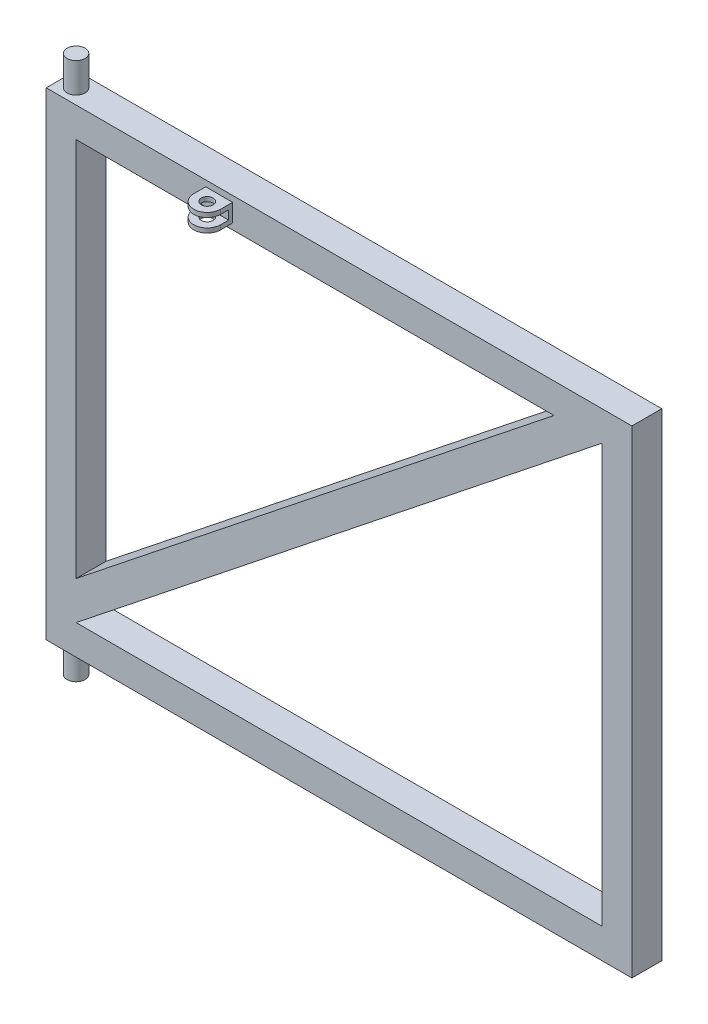
ISO-10303-21;
HEADER;
FILE_DESCRIPTION(('STEP AP214'),'2;1');
FILE_NAME('part.step','',(''),(''),'','','');
FILE_SCHEMA(('AUTOMOTIVE_DESIGN { 1 0 10303 214 1 1 1 1 }'));
ENDSEC;
DATA;
#1=APPLICATION_CONTEXT('core data for automotive mechanical design processes');
#2=APPLICATION_PROTOCOL_DEFINITION('international standard','automotive_design',2000,#1);
#3=PRODUCT_CONTEXT('',#1,'mechanical');
#4=PRODUCT('Part','Part','',(#3));
#5=PRODUCT_RELATED_PRODUCT_CATEGORY('part','',(#4));
#6=PRODUCT_DEFINITION_FORMATION('','',#4);
#7=PRODUCT_DEFINITION_CONTEXT('part definition',#1,'design');
#8=PRODUCT_DEFINITION('design','',#6,#7);
#9=PRODUCT_DEFINITION_SHAPE('','',#8);
#10=(LENGTH_UNIT() NAMED_UNIT(*) SI_UNIT(.MILLI.,.METRE.));
#11=(NAMED_UNIT(*) PLANE_ANGLE_UNIT() SI_UNIT($,.RADIAN.));
#12=(NAMED_UNIT(*) SI_UNIT($,.STERADIAN.) SOLID_ANGLE_UNIT());
#13=UNCERTAINTY_MEASURE_WITH_UNIT(LENGTH_MEASURE(1.E-05),#10,'distance_accuracy_value','');
#14=(GEOMETRIC_REPRESENTATION_CONTEXT(3) GLOBAL_UNCERTAINTY_ASSIGNED_CONTEXT((#13)) GLOBAL_UNIT_ASSIGNED_CONTEXT((#10,
#11,#12)) REPRESENTATION_CONTEXT('',''));
#15=CARTESIAN_POINT('',(0.,0.,0.));
#16=DIRECTION('',(0.,0.,1.));
#17=DIRECTION('',(1.,0.,0.));
#18=AXIS2_PLACEMENT_3D('',#15,#16,#17);
#19=CARTESIAN_POINT('',(311.828309325472,-10.,25.4731353954243));
#20=DIRECTION('',(-1.,0.,0.));
#21=DIRECTION('',(0.,0.,1.));
#22=AXIS2_PLACEMENT_3D('',#19,#20,#21);
#23=PLANE('',#22);
#24=DIRECTION('',(0.,0.,-1.));
#25=VECTOR('',#24,1.);
#26=CARTESIAN_POINT('',(311.828309325472,-32.5,25.4731353954243));
#27=LINE('',#26,#25);
#28=CARTESIAN_POINT('',(311.828309325472,-32.5,70.));
#29=VERTEX_POINT('',#28);
#30=CARTESIAN_POINT('',(311.828309325472,-32.5,56.6012916777462));
#31=VERTEX_POINT('',#30);
#32=EDGE_CURVE('E167',#29,#31,#27,.T.);
#33=ORIENTED_EDGE('',*,*,#32,.F.);
#34=DIRECTION('',(0.,-1.,0.));
#35=VECTOR('',#34,1.);
#36=CARTESIAN_POINT('',(311.828309325472,-10.,70.));
#37=LINE('',#36,#35);
#38=CARTESIAN_POINT('',(311.828309325472,-40.,70.));
#39=VERTEX_POINT('',#38);
#40=EDGE_CURVE('E202',#29,#39,#37,.T.);
#41=ORIENTED_EDGE('',*,*,#40,.T.);
#42=DIRECTION('',(0.,0.,-1.));
#43=VECTOR('',#42,1.);
#44=CARTESIAN_POINT('',(311.828309325472,-40.,25.4731353954243));
#45=LINE('',#44,#43);
#46=CARTESIAN_POINT('',(311.828309325472,-40.,50.));
#47=VERTEX_POINT('',#46);
#48=EDGE_CURVE('E192',#39,#47,#45,.T.);
#49=ORIENTED_EDGE('',*,*,#48,.T.);
#50=DIRECTION('',(0.,-1.,0.));
#51=VECTOR('',#50,1.);
#52=CARTESIAN_POINT('',(311.828309325472,0.,50.));
#53=LINE('',#52,#51);
#54=CARTESIAN_POINT('',(311.828309325472,-10.,50.));
#55=VERTEX_POINT('',#54);
#56=EDGE_CURVE('E40',#55,#47,#53,.T.);
#57=ORIENTED_EDGE('',*,*,#56,.F.);
#58=DIRECTION('',(0.,0.,-1.));
#59=VECTOR('',#58,1.);
#60=CARTESIAN_POINT('',(311.828309325472,-10.,25.4731353954243));
#61=LINE('',#60,#59);
#62=CARTESIAN_POINT('',(311.828309325472,-10.,70.));
#63=VERTEX_POINT('',#62);
#64=EDGE_CURVE('E195',#63,#55,#61,.T.);
#65=ORIENTED_EDGE('',*,*,#64,.F.);
#66=CARTESIAN_POINT('',(311.828309325472,-17.5,70.));
#67=VERTEX_POINT('',#66);
#68=EDGE_CURVE('E176',#63,#67,#37,.T.);
#69=ORIENTED_EDGE('',*,*,#68,.T.);
#70=DIRECTION('',(0.,0.,-1.));
#71=VECTOR('',#70,1.);
#72=CARTESIAN_POINT('',(311.828309325472,-17.5,25.4731353954243));
#73=LINE('',#72,#71);
#74=CARTESIAN_POINT('',(311.828309325472,-17.5,56.6012916777462));
#75=VERTEX_POINT('',#74);
#76=EDGE_CURVE('E47',#67,#75,#73,.T.);
#77=ORIENTED_EDGE('',*,*,#76,.T.);
#78=DIRECTION('',(0.,-1.,0.));
#79=VECTOR('',#78,1.);
#80=CARTESIAN_POINT('',(311.828309325472,-10.,56.6012916777462));
#81=LINE('',#80,#79);
#82=EDGE_CURVE('E159',#75,#31,#81,.T.);
#83=ORIENTED_EDGE('',*,*,#82,.T.);
#84=EDGE_LOOP('',(#33,#41,#49,#57,#65,#69,#77,#83));
#85=FACE_BOUND('',#84,.T.);
#86=ADVANCED_FACE('F32',(#85),#23,.F.);
#87=CARTESIAN_POINT('',(266.828309325472,-10.,25.4731353954243));
#88=DIRECTION('',(1.,0.,0.));
#89=DIRECTION('',(0.,0.,-1.));
#90=AXIS2_PLACEMENT_3D('',#87,#88,#89);
#91=PLANE('',#90);
#92=DIRECTION('',(0.,0.,1.));
#93=VECTOR('',#92,1.);
#94=CARTESIAN_POINT('',(266.828309325472,-32.5,25.4731353954243));
#95=LINE('',#94,#93);
#96=CARTESIAN_POINT('',(266.828309325472,-32.5,56.6012916777462));
#97=VERTEX_POINT('',#96);
#98=CARTESIAN_POINT('',(266.828309325472,-32.5,70.));
#99=VERTEX_POINT('',#98);
#100=EDGE_CURVE('E186',#97,#99,#95,.T.);
#101=ORIENTED_EDGE('',*,*,#100,.F.);
#102=DIRECTION('',(0.,1.,0.));
#103=VECTOR('',#102,1.);
#104=CARTESIAN_POINT('',(266.828309325472,-10.,56.6012916777462));
#105=LINE('',#104,#103);
#106=CARTESIAN_POINT('',(266.828309325472,-17.5,56.6012916777462));
#107=VERTEX_POINT('',#106);
#108=EDGE_CURVE('E11',#97,#107,#105,.T.);
#109=ORIENTED_EDGE('',*,*,#108,.T.);
#110=DIRECTION('',(0.,0.,1.));
#111=VECTOR('',#110,1.);
#112=CARTESIAN_POINT('',(266.828309325472,-17.5,25.4731353954243));
#113=LINE('',#112,#111);
#114=CARTESIAN_POINT('',(266.828309325472,-17.5,70.));
#115=VERTEX_POINT('',#114);
#116=EDGE_CURVE('E171',#107,#115,#113,.T.);
#117=ORIENTED_EDGE('',*,*,#116,.T.);
#118=DIRECTION('',(0.,-1.,0.));
#119=VECTOR('',#118,1.);
#120=CARTESIAN_POINT('',(266.828309325472,-10.,70.));
#121=LINE('',#120,#119);
#122=CARTESIAN_POINT('',(266.828309325472,-10.,70.));
#123=VERTEX_POINT('',#122);
#124=EDGE_CURVE('E212',#123,#115,#121,.T.);
#125=ORIENTED_EDGE('',*,*,#124,.F.);
#126=DIRECTION('',(0.,0.,1.));
#127=VECTOR('',#126,1.);
#128=CARTESIAN_POINT('',(266.828309325472,-10.,25.4731353954243));
#129=LINE('',#128,#127);
#130=CARTESIAN_POINT('',(266.828309325472,-10.,50.));
#131=VERTEX_POINT('',#130);
#132=EDGE_CURVE('E55',#131,#123,#129,.T.);
#133=ORIENTED_EDGE('',*,*,#132,.F.);
#134=DIRECTION('',(0.,1.,0.));
#135=VECTOR('',#134,1.);
#136=CARTESIAN_POINT('',(266.828309325472,0.,50.));
#137=LINE('',#136,#135);
#138=CARTESIAN_POINT('',(266.828309325472,-40.,50.));
#139=VERTEX_POINT('',#138);
#140=EDGE_CURVE('E305',#139,#131,#137,.T.);
#141=ORIENTED_EDGE('',*,*,#140,.F.);
#142=DIRECTION('',(0.,0.,1.));
#143=VECTOR('',#142,1.);
#144=CARTESIAN_POINT('',(266.828309325472,-40.,25.4731353954243));
#145=LINE('',#144,#143);
#146=CARTESIAN_POINT('',(266.828309325472,-40.,70.));
#147=VERTEX_POINT('',#146);
#148=EDGE_CURVE('E205',#139,#147,#145,.T.);
#149=ORIENTED_EDGE('',*,*,#148,.T.);
#150=EDGE_CURVE('E211',#99,#147,#121,.T.);
#151=ORIENTED_EDGE('',*,*,#150,.F.);
#152=EDGE_LOOP('',(#101,#109,#117,#125,#133,#141,#149,#151));
#153=FACE_BOUND('',#152,.T.);
#154=ADVANCED_FACE('F325',(#153),#91,.F.);
#155=CARTESIAN_POINT('',(289.328309325472,-10.,70.));
#156=DIRECTION('',(0.,-1.,0.));
#157=DIRECTION('',(0.,0.,-1.));
#158=AXIS2_PLACEMENT_3D('',#155,#156,#157);
#159=CYLINDRICAL_SURFACE('',#158,22.5);
#160=CARTESIAN_POINT('',(289.328309325472,-32.5,70.));
#161=DIRECTION('',(0.,1.,0.));
#162=DIRECTION('',(0.,0.,1.));
#163=AXIS2_PLACEMENT_3D('',#160,#161,#162);
#164=CIRCLE('',#163,22.5);
#165=EDGE_CURVE('E180',#99,#29,#164,.T.);
#166=ORIENTED_EDGE('',*,*,#165,.F.);
#167=ORIENTED_EDGE('',*,*,#150,.T.);
#168=CARTESIAN_POINT('',(289.328309325472,-40.,70.));
#169=DIRECTION('',(0.,1.,0.));
#170=DIRECTION('',(0.,0.,1.));
#171=AXIS2_PLACEMENT_3D('',#168,#169,#170);
#172=CIRCLE('',#171,22.5);
#173=EDGE_CURVE('E198',#147,#39,#172,.T.);
#174=ORIENTED_EDGE('',*,*,#173,.T.);
#175=ORIENTED_EDGE('',*,*,#40,.F.);
#176=EDGE_LOOP('',(#166,#167,#174,#175));
#177=FACE_BOUND('',#176,.T.);
#178=ADVANCED_FACE('F329',(#177),#159,.T.);
#179=CARTESIAN_POINT('',(289.328309325472,-10.,70.));
#180=DIRECTION('',(0.,-1.,0.));
#181=DIRECTION('',(0.,0.,-1.));
#182=AXIS2_PLACEMENT_3D('',#179,#180,#181);
#183=CYLINDRICAL_SURFACE('',#182,9.99999999999998);
#184=CARTESIAN_POINT('',(289.328309325472,-40.,70.));
#185=DIRECTION('',(0.,1.,0.));
#186=DIRECTION('',(0.,0.,1.));
#187=AXIS2_PLACEMENT_3D('',#184,#185,#186);
#188=CIRCLE('',#187,9.99999999999998);
#189=CARTESIAN_POINT('',(289.328309325472,-40.,80.));
#190=VERTEX_POINT('',#189);
#191=EDGE_CURVE('E166',#190,#190,#188,.T.);
#192=ORIENTED_EDGE('',*,*,#191,.F.);
#193=EDGE_LOOP('',(#192));
#194=FACE_BOUND('',#193,.T.);
#195=CARTESIAN_POINT('',(289.328309325472,-32.5,70.));
#196=DIRECTION('',(0.,1.,0.));
#197=DIRECTION('',(0.,0.,1.));
#198=AXIS2_PLACEMENT_3D('',#195,#196,#197);
#199=CIRCLE('',#198,9.99999999999998);
#200=CARTESIAN_POINT('',(289.328309325472,-32.5,80.));
#201=VERTEX_POINT('',#200);
#202=EDGE_CURVE('E177',#201,#201,#199,.T.);
#203=ORIENTED_EDGE('',*,*,#202,.T.);
#204=EDGE_LOOP('',(#203));
#205=FACE_BOUND('',#204,.T.);
#206=ADVANCED_FACE('F352',(#194,#205),#183,.F.);
#207=CARTESIAN_POINT('',(0.,0.,50.));
#208=DIRECTION('',(0.,0.,1.));
#209=DIRECTION('',(1.,0.,0.));
#210=AXIS2_PLACEMENT_3D('',#207,#208,#209);
#211=PLANE('',#210);
#212=DIRECTION('',(1.,0.,0.));
#213=VECTOR('',#212,1.);
#214=CARTESIAN_POINT('',(50.,-750.,50.));
#215=LINE('',#214,#213);
#216=CARTESIAN_POINT('',(50.,-750.,50.));
#217=VERTEX_POINT('',#216);
#218=CARTESIAN_POINT('',(930.,-750.,50.));
#219=VERTEX_POINT('',#218);
#220=EDGE_CURVE('E224',#217,#219,#215,.T.);
#221=ORIENTED_EDGE('',*,*,#220,.F.);
#222=DIRECTION('',(-0.782601054175649,-0.622523565821539,0.));
#223=VECTOR('',#222,1.);
#224=CARTESIAN_POINT('',(930.,-50.,50.));
#225=LINE('',#224,#223);
#226=CARTESIAN_POINT('',(930.,-50.,50.));
#227=VERTEX_POINT('',#226);
#228=EDGE_CURVE('E222',#227,#217,#225,.T.);
#229=ORIENTED_EDGE('',*,*,#228,.F.);
#230=DIRECTION('',(0.,1.,0.));
#231=VECTOR('',#230,1.);
#232=CARTESIAN_POINT('',(930.,-50.,50.));
#233=LINE('',#232,#231);
#234=EDGE_CURVE('E228',#219,#227,#233,.T.);
#235=ORIENTED_EDGE('',*,*,#234,.F.);
#236=EDGE_LOOP('',(#221,#229,#235));
#237=FACE_BOUND('',#236,.T.);
#238=DIRECTION('',(0.,-1.,0.));
#239=VECTOR('',#238,1.);
#240=CARTESIAN_POINT('',(0.,0.,50.));
#241=LINE('',#240,#239);
#242=CARTESIAN_POINT('',(0.,0.,50.));
#243=VERTEX_POINT('',#242);
#244=CARTESIAN_POINT('',(0.,-800.,50.));
#245=VERTEX_POINT('',#244);
#246=EDGE_CURVE('E270',#243,#245,#241,.T.);
#247=ORIENTED_EDGE('',*,*,#246,.T.);
#248=DIRECTION('',(1.,0.,0.));
#249=VECTOR('',#248,1.);
#250=CARTESIAN_POINT('',(0.,-800.,50.));
#251=LINE('',#250,#249);
#252=CARTESIAN_POINT('',(980.,-800.,50.));
#253=VERTEX_POINT('',#252);
#254=EDGE_CURVE('E273',#245,#253,#251,.T.);
#255=ORIENTED_EDGE('',*,*,#254,.T.);
#256=DIRECTION('',(0.,1.,0.));
#257=VECTOR('',#256,1.);
#258=CARTESIAN_POINT('',(980.,0.,50.));
#259=LINE('',#258,#257);
#260=CARTESIAN_POINT('',(980.,0.,50.));
#261=VERTEX_POINT('',#260);
#262=EDGE_CURVE('E276',#253,#261,#259,.T.);
#263=ORIENTED_EDGE('',*,*,#262,.T.);
#264=DIRECTION('',(-1.,0.,0.));
#265=VECTOR('',#264,1.);
#266=CARTESIAN_POINT('',(0.,0.,50.));
#267=LINE('',#266,#265);
#268=EDGE_CURVE('E278',#261,#243,#267,.T.);
#269=ORIENTED_EDGE('',*,*,#268,.T.);
#270=EDGE_LOOP('',(#247,#255,#263,#269));
#271=FACE_BOUND('',#270,.T.);
#272=DIRECTION('',(0.782601054175649,0.622523565821539,0.));
#273=VECTOR('',#272,1.);
#274=CARTESIAN_POINT('',(849.681755446454,-50.,50.));
#275=LINE('',#274,#273);
#276=CARTESIAN_POINT('',(50.0000000000002,-686.110487286952,50.));
#277=VERTEX_POINT('',#276);
#278=CARTESIAN_POINT('',(849.681755446454,-50.,50.));
#279=VERTEX_POINT('',#278);
#280=EDGE_CURVE('E248',#277,#279,#275,.T.);
#281=ORIENTED_EDGE('',*,*,#280,.F.);
#282=DIRECTION('',(0.,-1.,0.));
#283=VECTOR('',#282,1.);
#284=CARTESIAN_POINT('',(50.,-50.,50.));
#285=LINE('',#284,#283);
#286=CARTESIAN_POINT('',(50.,-50.,50.));
#287=VERTEX_POINT('',#286);
#288=EDGE_CURVE('E246',#287,#277,#285,.T.);
#289=ORIENTED_EDGE('',*,*,#288,.F.);
#290=DIRECTION('',(-1.,0.,0.));
#291=VECTOR('',#290,1.);
#292=CARTESIAN_POINT('',(50.,-50.,50.));
#293=LINE('',#292,#291);
#294=EDGE_CURVE('E252',#279,#287,#293,.T.);
#295=ORIENTED_EDGE('',*,*,#294,.F.);
#296=EDGE_LOOP('',(#281,#289,#295));
#297=FACE_BOUND('',#296,.T.);
#298=DIRECTION('',(-1.,0.,0.));
#299=VECTOR('',#298,1.);
#300=CARTESIAN_POINT('',(0.,-10.,50.));
#301=LINE('',#300,#299);
#302=EDGE_CURVE('E311',#55,#131,#301,.T.);
#303=ORIENTED_EDGE('',*,*,#302,.F.);
#304=ORIENTED_EDGE('',*,*,#56,.T.);
#305=DIRECTION('',(-1.,0.,0.));
#306=VECTOR('',#305,1.);
#307=CARTESIAN_POINT('',(0.,-40.,50.));
#308=LINE('',#307,#306);
#309=EDGE_CURVE('E308',#47,#139,#308,.T.);
#310=ORIENTED_EDGE('',*,*,#309,.T.);
#311=ORIENTED_EDGE('',*,*,#140,.T.);
#312=EDGE_LOOP('',(#303,#304,#310,#311));
#313=FACE_BOUND('',#312,.T.);
#314=ADVANCED_FACE('F335',(#237,#271,#297,#313),#211,.T.);
#315=CARTESIAN_POINT('',(0.,-800.,50.));
#316=DIRECTION('',(0.,1.,0.));
#317=DIRECTION('',(0.,0.,1.));
#318=AXIS2_PLACEMENT_3D('',#315,#316,#317);
#319=PLANE('',#318);
#320=DIRECTION('',(1.,0.,0.));
#321=VECTOR('',#320,1.);
#322=CARTESIAN_POINT('',(0.,-800.,0.));
#323=LINE('',#322,#321);
#324=CARTESIAN_POINT('',(0.,-800.,0.));
#325=VERTEX_POINT('',#324);
#326=CARTESIAN_POINT('',(980.,-800.,0.));
#327=VERTEX_POINT('',#326);
#328=EDGE_CURVE('E283',#325,#327,#323,.T.);
#329=ORIENTED_EDGE('',*,*,#328,.T.);
#330=DIRECTION('',(0.,0.,-1.));
#331=VECTOR('',#330,1.);
#332=CARTESIAN_POINT('',(980.,-800.,50.));
#333=LINE('',#332,#331);
#334=EDGE_CURVE('E293',#253,#327,#333,.T.);
#335=ORIENTED_EDGE('',*,*,#334,.F.);
#336=ORIENTED_EDGE('',*,*,#254,.F.);
#337=DIRECTION('',(0.,0.,-1.));
#338=VECTOR('',#337,1.);
#339=CARTESIAN_POINT('',(0.,-800.,50.));
#340=LINE('',#339,#338);
#341=EDGE_CURVE('E296',#245,#325,#340,.T.);
#342=ORIENTED_EDGE('',*,*,#341,.T.);
#343=EDGE_LOOP('',(#329,#335,#336,#342));
#344=FACE_BOUND('',#343,.T.);
#345=CARTESIAN_POINT('',(25.0000000000001,-800.,25.));
#346=DIRECTION('',(0.,1.,0.));
#347=DIRECTION('',(0.,0.,1.));
#348=AXIS2_PLACEMENT_3D('',#345,#346,#347);
#349=CIRCLE('',#348,15.1806494494517);
#350=CARTESIAN_POINT('',(25.0000000000001,-800.,40.1806494494517));
#351=VERTEX_POINT('',#350);
#352=EDGE_CURVE('E302',#351,#351,#349,.F.);
#353=ORIENTED_EDGE('',*,*,#352,.F.);
#354=EDGE_LOOP('',(#353));
#355=FACE_BOUND('',#354,.T.);
#356=ADVANCED_FACE('F405',(#344,#355),#319,.F.);
#357=CARTESIAN_POINT('',(0.,0.,50.));
#358=DIRECTION('',(0.,-1.,0.));
#359=DIRECTION('',(0.,0.,-1.));
#360=AXIS2_PLACEMENT_3D('',#357,#358,#359);
#361=PLANE('',#360);
#362=DIRECTION('',(-1.,0.,0.));
#363=VECTOR('',#362,1.);
#364=CARTESIAN_POINT('',(0.,0.,0.));
#365=LINE('',#364,#363);
#366=CARTESIAN_POINT('',(980.,0.,0.));
#367=VERTEX_POINT('',#366);
#368=CARTESIAN_POINT('',(0.,0.,0.));
#369=VERTEX_POINT('',#368);
#370=EDGE_CURVE('E274',#367,#369,#365,.T.);
#371=ORIENTED_EDGE('',*,*,#370,.T.);
#372=DIRECTION('',(0.,0.,-1.));
#373=VECTOR('',#372,1.);
#374=CARTESIAN_POINT('',(0.,0.,50.));
#375=LINE('',#374,#373);
#376=EDGE_CURVE('E280',#243,#369,#375,.T.);
#377=ORIENTED_EDGE('',*,*,#376,.F.);
#378=ORIENTED_EDGE('',*,*,#268,.F.);
#379=DIRECTION('',(0.,0.,-1.));
#380=VECTOR('',#379,1.);
#381=CARTESIAN_POINT('',(980.,0.,50.));
#382=LINE('',#381,#380);
#383=EDGE_CURVE('E290',#261,#367,#382,.T.);
#384=ORIENTED_EDGE('',*,*,#383,.T.);
#385=EDGE_LOOP('',(#371,#377,#378,#384));
#386=FACE_BOUND('',#385,.T.);
#387=CARTESIAN_POINT('',(25.,0.,25.));
#388=DIRECTION('',(0.,-1.,0.));
#389=DIRECTION('',(0.,0.,-1.));
#390=AXIS2_PLACEMENT_3D('',#387,#388,#389);
#391=CIRCLE('',#390,15.);
#392=CARTESIAN_POINT('',(25.,0.,10.));
#393=VERTEX_POINT('',#392);
#394=EDGE_CURVE('E299',#393,#393,#391,.F.);
#395=ORIENTED_EDGE('',*,*,#394,.F.);
#396=EDGE_LOOP('',(#395));
#397=FACE_BOUND('',#396,.T.);
#398=ADVANCED_FACE('F410',(#386,#397),#361,.F.);
#399=CARTESIAN_POINT('',(0.,0.,0.));
#400=DIRECTION('',(0.,0.,1.));
#401=DIRECTION('',(1.,0.,0.));
#402=AXIS2_PLACEMENT_3D('',#399,#400,#401);
#403=PLANE('',#402);
#404=DIRECTION('',(0.,-1.,0.));
#405=VECTOR('',#404,1.);
#406=CARTESIAN_POINT('',(50.,-50.,0.));
#407=LINE('',#406,#405);
#408=CARTESIAN_POINT('',(50.,-50.,0.));
#409=VERTEX_POINT('',#408);
#410=CARTESIAN_POINT('',(50.0000000000002,-686.110487286952,0.));
#411=VERTEX_POINT('',#410);
#412=EDGE_CURVE('E245',#409,#411,#407,.T.);
#413=ORIENTED_EDGE('',*,*,#412,.T.);
#414=DIRECTION('',(0.782601054175649,0.622523565821539,0.));
#415=VECTOR('',#414,1.);
#416=CARTESIAN_POINT('',(849.681755446454,-50.,0.));
#417=LINE('',#416,#415);
#418=CARTESIAN_POINT('',(849.681755446454,-50.,0.));
#419=VERTEX_POINT('',#418);
#420=EDGE_CURVE('E257',#411,#419,#417,.T.);
#421=ORIENTED_EDGE('',*,*,#420,.T.);
#422=DIRECTION('',(-1.,0.,0.));
#423=VECTOR('',#422,1.);
#424=CARTESIAN_POINT('',(50.,-50.,0.));
#425=LINE('',#424,#423);
#426=EDGE_CURVE('E249',#419,#409,#425,.T.);
#427=ORIENTED_EDGE('',*,*,#426,.T.);
#428=EDGE_LOOP('',(#413,#421,#427));
#429=FACE_BOUND('',#428,.T.);
#430=DIRECTION('',(0.,-1.,0.));
#431=VECTOR('',#430,1.);
#432=CARTESIAN_POINT('',(0.,0.,0.));
#433=LINE('',#432,#431);
#434=EDGE_CURVE('E269',#369,#325,#433,.T.);
#435=ORIENTED_EDGE('',*,*,#434,.F.);
#436=ORIENTED_EDGE('',*,*,#370,.F.);
#437=DIRECTION('',(0.,1.,0.));
#438=VECTOR('',#437,1.);
#439=CARTESIAN_POINT('',(980.,0.,0.));
#440=LINE('',#439,#438);
#441=EDGE_CURVE('E285',#327,#367,#440,.T.);
#442=ORIENTED_EDGE('',*,*,#441,.F.);
#443=ORIENTED_EDGE('',*,*,#328,.F.);
#444=EDGE_LOOP('',(#435,#436,#442,#443));
#445=FACE_BOUND('',#444,.T.);
#446=DIRECTION('',(-0.782601054175649,-0.622523565821539,0.));
#447=VECTOR('',#446,1.);
#448=CARTESIAN_POINT('',(930.,-50.,0.));
#449=LINE('',#448,#447);
#450=CARTESIAN_POINT('',(930.,-50.,0.));
#451=VERTEX_POINT('',#450);
#452=CARTESIAN_POINT('',(50.,-750.,0.));
#453=VERTEX_POINT('',#452);
#454=EDGE_CURVE('E221',#451,#453,#449,.T.);
#455=ORIENTED_EDGE('',*,*,#454,.T.);
#456=DIRECTION('',(1.,0.,0.));
#457=VECTOR('',#456,1.);
#458=CARTESIAN_POINT('',(50.,-750.,0.));
#459=LINE('',#458,#457);
#460=CARTESIAN_POINT('',(930.,-750.,0.));
#461=VERTEX_POINT('',#460);
#462=EDGE_CURVE('E233',#453,#461,#459,.T.);
#463=ORIENTED_EDGE('',*,*,#462,.T.);
#464=DIRECTION('',(0.,1.,0.));
#465=VECTOR('',#464,1.);
#466=CARTESIAN_POINT('',(930.,-50.,0.));
#467=LINE('',#466,#465);
#468=EDGE_CURVE('E225',#461,#451,#467,.T.);
#469=ORIENTED_EDGE('',*,*,#468,.T.);
#470=EDGE_LOOP('',(#455,#463,#469));
#471=FACE_BOUND('',#470,.T.);
#472=ADVANCED_FACE('F407',(#429,#445,#471),#403,.F.);
#473=CARTESIAN_POINT('',(0.,0.,50.));
#474=DIRECTION('',(1.,0.,0.));
#475=DIRECTION('',(0.,1.,0.));
#476=AXIS2_PLACEMENT_3D('',#473,#474,#475);
#477=PLANE('',#476);
#478=ORIENTED_EDGE('',*,*,#434,.T.);
#479=ORIENTED_EDGE('',*,*,#341,.F.);
#480=ORIENTED_EDGE('',*,*,#246,.F.);
#481=ORIENTED_EDGE('',*,*,#376,.T.);
#482=EDGE_LOOP('',(#478,#479,#480,#481));
#483=FACE_BOUND('',#482,.T.);
#484=ADVANCED_FACE('F34',(#483),#477,.F.);
#485=CARTESIAN_POINT('',(980.,0.,50.));
#486=DIRECTION('',(-1.,0.,0.));
#487=DIRECTION('',(0.,-1.,0.));
#488=AXIS2_PLACEMENT_3D('',#485,#486,#487);
#489=PLANE('',#488);
#490=ORIENTED_EDGE('',*,*,#441,.T.);
#491=ORIENTED_EDGE('',*,*,#383,.F.);
#492=ORIENTED_EDGE('',*,*,#262,.F.);
#493=ORIENTED_EDGE('',*,*,#334,.T.);
#494=EDGE_LOOP('',(#490,#491,#492,#493));
#495=FACE_BOUND('',#494,.T.);
#496=ADVANCED_FACE('F401',(#495),#489,.F.);
#497=CARTESIAN_POINT('',(50.,-50.,50.));
#498=DIRECTION('',(1.,0.,0.));
#499=DIRECTION('',(0.,1.,0.));
#500=AXIS2_PLACEMENT_3D('',#497,#498,#499);
#501=PLANE('',#500);
#502=ORIENTED_EDGE('',*,*,#412,.F.);
#503=DIRECTION('',(0.,0.,-1.));
#504=VECTOR('',#503,1.);
#505=CARTESIAN_POINT('',(50.,-50.,50.));
#506=LINE('',#505,#504);
#507=EDGE_CURVE('E254',#287,#409,#506,.T.);
#508=ORIENTED_EDGE('',*,*,#507,.F.);
#509=ORIENTED_EDGE('',*,*,#288,.T.);
#510=DIRECTION('',(0.,0.,-1.));
#511=VECTOR('',#510,1.);
#512=CARTESIAN_POINT('',(50.0000000000002,-686.110487286952,50.));
#513=LINE('',#512,#511);
#514=EDGE_CURVE('E266',#277,#411,#513,.T.);
#515=ORIENTED_EDGE('',*,*,#514,.T.);
#516=EDGE_LOOP('',(#502,#508,#509,#515));
#517=FACE_BOUND('',#516,.T.);
#518=ADVANCED_FACE('F397',(#517),#501,.T.);
#519=CARTESIAN_POINT('',(849.681755446454,-50.,50.));
#520=DIRECTION('',(-0.622523565821539,0.782601054175648,0.));
#521=DIRECTION('',(-0.782601054175648,-0.622523565821539,0.));
#522=AXIS2_PLACEMENT_3D('',#519,#520,#521);
#523=PLANE('',#522);
#524=ORIENTED_EDGE('',*,*,#420,.F.);
#525=ORIENTED_EDGE('',*,*,#514,.F.);
#526=ORIENTED_EDGE('',*,*,#280,.T.);
#527=DIRECTION('',(0.,0.,-1.));
#528=VECTOR('',#527,1.);
#529=CARTESIAN_POINT('',(849.681755446454,-50.,50.));
#530=LINE('',#529,#528);
#531=EDGE_CURVE('E264',#279,#419,#530,.T.);
#532=ORIENTED_EDGE('',*,*,#531,.T.);
#533=EDGE_LOOP('',(#524,#525,#526,#532));
#534=FACE_BOUND('',#533,.T.);
#535=ADVANCED_FACE('F393',(#534),#523,.T.);
#536=CARTESIAN_POINT('',(50.,-50.,50.));
#537=DIRECTION('',(0.,-1.,0.));
#538=DIRECTION('',(1.,0.,0.));
#539=AXIS2_PLACEMENT_3D('',#536,#537,#538);
#540=PLANE('',#539);
#541=ORIENTED_EDGE('',*,*,#426,.F.);
#542=ORIENTED_EDGE('',*,*,#531,.F.);
#543=ORIENTED_EDGE('',*,*,#294,.T.);
#544=ORIENTED_EDGE('',*,*,#507,.T.);
#545=EDGE_LOOP('',(#541,#542,#543,#544));
#546=FACE_BOUND('',#545,.T.);
#547=ADVANCED_FACE('F389',(#546),#540,.T.);
#548=CARTESIAN_POINT('',(930.,-50.,50.));
#549=DIRECTION('',(0.622523565821539,-0.782601054175649,0.));
#550=DIRECTION('',(0.782601054175649,0.622523565821539,0.));
#551=AXIS2_PLACEMENT_3D('',#548,#549,#550);
#552=PLANE('',#551);
#553=ORIENTED_EDGE('',*,*,#454,.F.);
#554=DIRECTION('',(0.,0.,-1.));
#555=VECTOR('',#554,1.);
#556=CARTESIAN_POINT('',(930.,-50.,50.));
#557=LINE('',#556,#555);
#558=EDGE_CURVE('E230',#227,#451,#557,.T.);
#559=ORIENTED_EDGE('',*,*,#558,.F.);
#560=ORIENTED_EDGE('',*,*,#228,.T.);
#561=DIRECTION('',(0.,0.,-1.));
#562=VECTOR('',#561,1.);
#563=CARTESIAN_POINT('',(50.,-750.,50.));
#564=LINE('',#563,#562);
#565=EDGE_CURVE('E242',#217,#453,#564,.T.);
#566=ORIENTED_EDGE('',*,*,#565,.T.);
#567=EDGE_LOOP('',(#553,#559,#560,#566));
#568=FACE_BOUND('',#567,.T.);
#569=ADVANCED_FACE('F385',(#568),#552,.T.);
#570=CARTESIAN_POINT('',(50.,-750.,50.));
#571=DIRECTION('',(0.,1.,0.));
#572=DIRECTION('',(0.,0.,1.));
#573=AXIS2_PLACEMENT_3D('',#570,#571,#572);
#574=PLANE('',#573);
#575=ORIENTED_EDGE('',*,*,#462,.F.);
#576=ORIENTED_EDGE('',*,*,#565,.F.);
#577=ORIENTED_EDGE('',*,*,#220,.T.);
#578=DIRECTION('',(0.,0.,-1.));
#579=VECTOR('',#578,1.);
#580=CARTESIAN_POINT('',(930.,-750.,50.));
#581=LINE('',#580,#579);
#582=EDGE_CURVE('E240',#219,#461,#581,.T.);
#583=ORIENTED_EDGE('',*,*,#582,.T.);
#584=EDGE_LOOP('',(#575,#576,#577,#583));
#585=FACE_BOUND('',#584,.T.);
#586=ADVANCED_FACE('F381',(#585),#574,.T.);
#587=CARTESIAN_POINT('',(930.,-50.,50.));
#588=DIRECTION('',(-1.,0.,0.));
#589=DIRECTION('',(0.,-1.,0.));
#590=AXIS2_PLACEMENT_3D('',#587,#588,#589);
#591=PLANE('',#590);
#592=ORIENTED_EDGE('',*,*,#468,.F.);
#593=ORIENTED_EDGE('',*,*,#582,.F.);
#594=ORIENTED_EDGE('',*,*,#234,.T.);
#595=ORIENTED_EDGE('',*,*,#558,.T.);
#596=EDGE_LOOP('',(#592,#593,#594,#595));
#597=FACE_BOUND('',#596,.T.);
#598=ADVANCED_FACE('F377',(#597),#591,.T.);
#599=CARTESIAN_POINT('',(25.,50.,25.));
#600=DIRECTION('',(0.,-1.,0.));
#601=DIRECTION('',(0.,0.,-1.));
#602=AXIS2_PLACEMENT_3D('',#599,#600,#601);
#603=CYLINDRICAL_SURFACE('',#602,15.);
#604=CARTESIAN_POINT('',(25.,50.,25.));
#605=DIRECTION('',(0.,1.,0.));
#606=DIRECTION('',(0.,0.,1.));
#607=AXIS2_PLACEMENT_3D('',#604,#605,#606);
#608=CIRCLE('',#607,15.);
#609=CARTESIAN_POINT('',(25.,50.,40.));
#610=VERTEX_POINT('',#609);
#611=EDGE_CURVE('E218',#610,#610,#608,.T.);
#612=ORIENTED_EDGE('',*,*,#611,.F.);
#613=EDGE_LOOP('',(#612));
#614=FACE_BOUND('',#613,.T.);
#615=ORIENTED_EDGE('',*,*,#394,.T.);
#616=EDGE_LOOP('',(#615));
#617=FACE_BOUND('',#616,.T.);
#618=ADVANCED_FACE('F373',(#614,#617),#603,.T.);
#619=CARTESIAN_POINT('',(25.,50.,25.));
#620=DIRECTION('',(0.,1.,0.));
#621=DIRECTION('',(0.,0.,1.));
#622=AXIS2_PLACEMENT_3D('',#619,#620,#621);
#623=PLANE('',#622);
#624=ORIENTED_EDGE('',*,*,#611,.T.);
#625=EDGE_LOOP('',(#624));
#626=FACE_BOUND('',#625,.T.);
#627=ADVANCED_FACE('F369',(#626),#623,.T.);
#628=CARTESIAN_POINT('',(25.0000000000001,-850.,25.));
#629=DIRECTION('',(0.,1.,0.));
#630=DIRECTION('',(0.,0.,1.));
#631=AXIS2_PLACEMENT_3D('',#628,#629,#630);
#632=CYLINDRICAL_SURFACE('',#631,15.1806494494517);
#633=CARTESIAN_POINT('',(25.0000000000001,-850.,25.));
#634=DIRECTION('',(0.,-1.,0.));
#635=DIRECTION('',(0.,0.,-1.));
#636=AXIS2_PLACEMENT_3D('',#633,#634,#635);
#637=CIRCLE('',#636,15.1806494494517);
#638=CARTESIAN_POINT('',(25.0000000000001,-850.,9.81935055054828));
#639=VERTEX_POINT('',#638);
#640=EDGE_CURVE('E215',#639,#639,#637,.T.);
#641=ORIENTED_EDGE('',*,*,#640,.F.);
#642=EDGE_LOOP('',(#641));
#643=FACE_BOUND('',#642,.T.);
#644=ORIENTED_EDGE('',*,*,#352,.T.);
#645=EDGE_LOOP('',(#644));
#646=FACE_BOUND('',#645,.T.);
#647=ADVANCED_FACE('F365',(#643,#646),#632,.T.);
#648=CARTESIAN_POINT('',(25.0000000000001,-850.,25.));
#649=DIRECTION('',(0.,-1.,0.));
#650=DIRECTION('',(0.,0.,-1.));
#651=AXIS2_PLACEMENT_3D('',#648,#649,#650);
#652=PLANE('',#651);
#653=ORIENTED_EDGE('',*,*,#640,.T.);
#654=EDGE_LOOP('',(#653));
#655=FACE_BOUND('',#654,.T.);
#656=ADVANCED_FACE('F362',(#655),#652,.T.);
#657=CARTESIAN_POINT('',(289.328309325472,-10.,70.));
#658=DIRECTION('',(0.,1.,0.));
#659=DIRECTION('',(0.,0.,1.));
#660=AXIS2_PLACEMENT_3D('',#657,#658,#659);
#661=PLANE('',#660);
#662=ORIENTED_EDGE('',*,*,#64,.T.);
#663=ORIENTED_EDGE('',*,*,#302,.T.);
#664=ORIENTED_EDGE('',*,*,#132,.T.);
#665=CARTESIAN_POINT('',(289.328309325472,-10.,70.));
#666=DIRECTION('',(0.,1.,0.));
#667=DIRECTION('',(0.,0.,1.));
#668=AXIS2_PLACEMENT_3D('',#665,#666,#667);
#669=CIRCLE('',#668,22.5);
#670=EDGE_CURVE('E200',#123,#63,#669,.T.);
#671=ORIENTED_EDGE('',*,*,#670,.T.);
#672=EDGE_LOOP('',(#662,#663,#664,#671));
#673=FACE_BOUND('',#672,.T.);
#674=CARTESIAN_POINT('',(289.328309325472,-10.,70.));
#675=DIRECTION('',(0.,1.,0.));
#676=DIRECTION('',(0.,0.,1.));
#677=AXIS2_PLACEMENT_3D('',#674,#675,#676);
#678=CIRCLE('',#677,9.99999999999998);
#679=CARTESIAN_POINT('',(289.328309325472,-10.,80.));
#680=VERTEX_POINT('',#679);
#681=EDGE_CURVE('E189',#680,#680,#678,.T.);
#682=ORIENTED_EDGE('',*,*,#681,.F.);
#683=EDGE_LOOP('',(#682));
#684=FACE_BOUND('',#683,.T.);
#685=ADVANCED_FACE('F337',(#673,#684),#661,.T.);
#686=CARTESIAN_POINT('',(289.328309325472,-40.,70.));
#687=DIRECTION('',(0.,1.,0.));
#688=DIRECTION('',(0.,0.,1.));
#689=AXIS2_PLACEMENT_3D('',#686,#687,#688);
#690=PLANE('',#689);
#691=ORIENTED_EDGE('',*,*,#309,.F.);
#692=ORIENTED_EDGE('',*,*,#48,.F.);
#693=ORIENTED_EDGE('',*,*,#173,.F.);
#694=ORIENTED_EDGE('',*,*,#148,.F.);
#695=EDGE_LOOP('',(#691,#692,#693,#694));
#696=FACE_BOUND('',#695,.T.);
#697=ORIENTED_EDGE('',*,*,#191,.T.);
#698=EDGE_LOOP('',(#697));
#699=FACE_BOUND('',#698,.T.);
#700=ADVANCED_FACE('F344',(#696,#699),#690,.F.);
#701=ORIENTED_EDGE('',*,*,#124,.T.);
#702=CARTESIAN_POINT('',(289.328309325472,-17.5,70.));
#703=DIRECTION('',(0.,1.,0.));
#704=DIRECTION('',(0.,0.,1.));
#705=AXIS2_PLACEMENT_3D('',#702,#703,#704);
#706=CIRCLE('',#705,22.5);
#707=EDGE_CURVE('E181',#115,#67,#706,.T.);
#708=ORIENTED_EDGE('',*,*,#707,.T.);
#709=ORIENTED_EDGE('',*,*,#68,.F.);
#710=ORIENTED_EDGE('',*,*,#670,.F.);
#711=EDGE_LOOP('',(#701,#708,#709,#710));
#712=FACE_BOUND('',#711,.T.);
#713=ADVANCED_FACE('F341',(#712),#159,.T.);
#714=CARTESIAN_POINT('',(289.328309325472,-17.5,70.));
#715=DIRECTION('',(0.,1.,0.));
#716=DIRECTION('',(0.,0.,1.));
#717=AXIS2_PLACEMENT_3D('',#714,#715,#716);
#718=CIRCLE('',#717,9.99999999999998);
#719=CARTESIAN_POINT('',(289.328309325472,-17.5,80.));
#720=VERTEX_POINT('',#719);
#721=EDGE_CURVE('E315',#720,#720,#718,.T.);
#722=ORIENTED_EDGE('',*,*,#721,.F.);
#723=EDGE_LOOP('',(#722));
#724=FACE_BOUND('',#723,.T.);
#725=ORIENTED_EDGE('',*,*,#681,.T.);
#726=EDGE_LOOP('',(#725));
#727=FACE_BOUND('',#726,.T.);
#728=ADVANCED_FACE('F343',(#724,#727),#183,.F.);
#729=CARTESIAN_POINT('',(250.342655580751,-32.5,56.6012916777462));
#730=DIRECTION('',(0.,0.,-1.));
#731=DIRECTION('',(-1.,0.,0.));
#732=AXIS2_PLACEMENT_3D('',#729,#730,#731);
#733=PLANE('',#732);
#734=DIRECTION('',(-1.,0.,0.));
#735=VECTOR('',#734,1.);
#736=CARTESIAN_POINT('',(250.342655580751,-17.5,56.6012916777462));
#737=LINE('',#736,#735);
#738=EDGE_CURVE('E161',#75,#107,#737,.T.);
#739=ORIENTED_EDGE('',*,*,#738,.T.);
#740=ORIENTED_EDGE('',*,*,#108,.F.);
#741=DIRECTION('',(-1.,0.,0.));
#742=VECTOR('',#741,1.);
#743=CARTESIAN_POINT('',(250.342655580751,-32.5,56.6012916777462));
#744=LINE('',#743,#742);
#745=EDGE_CURVE('E163',#31,#97,#744,.T.);
#746=ORIENTED_EDGE('',*,*,#745,.F.);
#747=ORIENTED_EDGE('',*,*,#82,.F.);
#748=EDGE_LOOP('',(#739,#740,#746,#747));
#749=FACE_BOUND('',#748,.T.);
#750=ADVANCED_FACE('F160',(#749),#733,.F.);
#751=CARTESIAN_POINT('',(0.,-32.5,0.));
#752=DIRECTION('',(0.,1.,0.));
#753=DIRECTION('',(0.,0.,1.));
#754=AXIS2_PLACEMENT_3D('',#751,#752,#753);
#755=PLANE('',#754);
#756=ORIENTED_EDGE('',*,*,#202,.F.);
#757=EDGE_LOOP('',(#756));
#758=FACE_BOUND('',#757,.T.);
#759=ORIENTED_EDGE('',*,*,#32,.T.);
#760=ORIENTED_EDGE('',*,*,#745,.T.);
#761=ORIENTED_EDGE('',*,*,#100,.T.);
#762=ORIENTED_EDGE('',*,*,#165,.T.);
#763=EDGE_LOOP('',(#759,#760,#761,#762));
#764=FACE_BOUND('',#763,.T.);
#765=ADVANCED_FACE('F322',(#758,#764),#755,.T.);
#766=CARTESIAN_POINT('',(0.,-17.5,0.));
#767=DIRECTION('',(0.,1.,0.));
#768=DIRECTION('',(0.,0.,1.));
#769=AXIS2_PLACEMENT_3D('',#766,#767,#768);
#770=PLANE('',#769);
#771=ORIENTED_EDGE('',*,*,#721,.T.);
#772=EDGE_LOOP('',(#771));
#773=FACE_BOUND('',#772,.T.);
#774=ORIENTED_EDGE('',*,*,#707,.F.);
#775=ORIENTED_EDGE('',*,*,#116,.F.);
#776=ORIENTED_EDGE('',*,*,#738,.F.);
#777=ORIENTED_EDGE('',*,*,#76,.F.);
#778=EDGE_LOOP('',(#774,#775,#776,#777));
#779=FACE_BOUND('',#778,.T.);
#780=ADVANCED_FACE('F169',(#773,#779),#770,.F.);
#781=CLOSED_SHELL('',(#86,#154,#178,#206,#314,#356,#398,#472,#484,#496,#518,#535,#547,#569,#586,
#598,#618,#627,#647,#656,#685,#700,#713,#728,#750,#765,#780));
#782=MANIFOLD_SOLID_BREP('B2',#781);
#783=ADVANCED_BREP_SHAPE_REPRESENTATION('',(#18,#782),#14);
#784=SHAPE_DEFINITION_REPRESENTATION(#9,#783);
ENDSEC;
END-ISO-10303-21;
